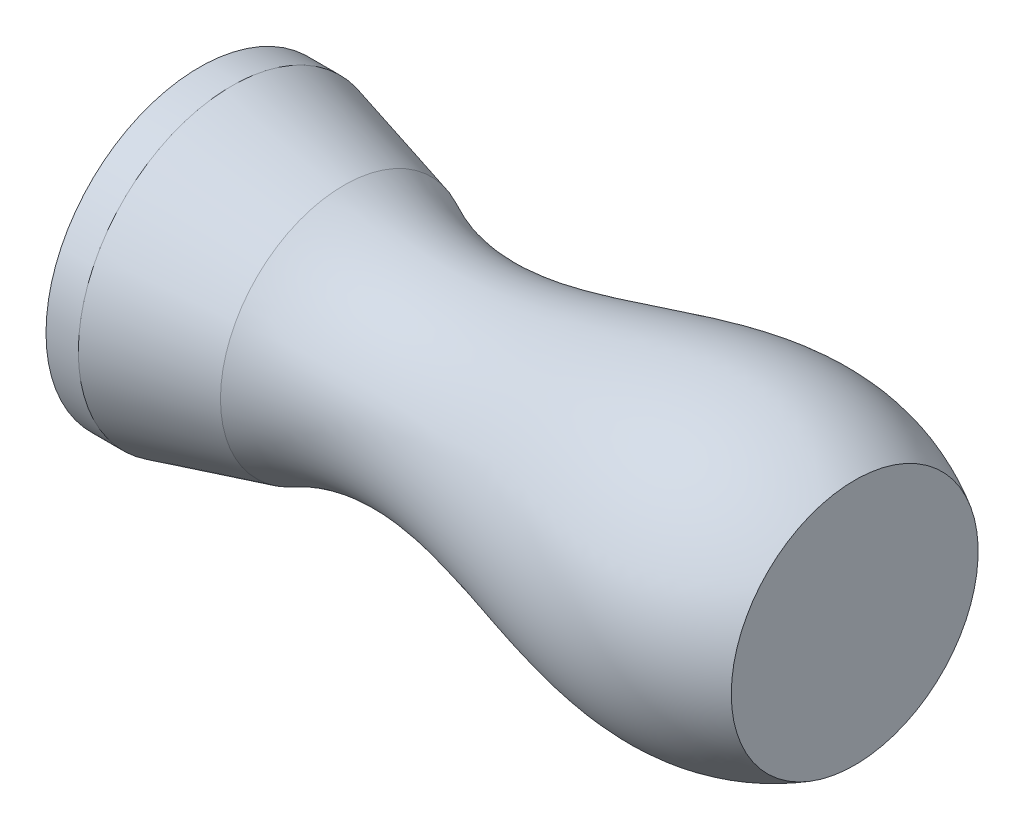
ISO-10303-21;
HEADER;
FILE_DESCRIPTION(('STEP AP214'),'2;1');
FILE_NAME('part.step','',(''),(''),'','','');
FILE_SCHEMA(('AUTOMOTIVE_DESIGN { 1 0 10303 214 1 1 1 1 }'));
ENDSEC;
DATA;
#1=APPLICATION_CONTEXT('core data for automotive mechanical design processes');
#2=APPLICATION_PROTOCOL_DEFINITION('international standard','automotive_design',2000,#1);
#3=PRODUCT_CONTEXT('',#1,'mechanical');
#4=PRODUCT('Part','Part','',(#3));
#5=PRODUCT_RELATED_PRODUCT_CATEGORY('part','',(#4));
#6=PRODUCT_DEFINITION_FORMATION('','',#4);
#7=PRODUCT_DEFINITION_CONTEXT('part definition',#1,'design');
#8=PRODUCT_DEFINITION('design','',#6,#7);
#9=PRODUCT_DEFINITION_SHAPE('','',#8);
#10=(LENGTH_UNIT() NAMED_UNIT(*) SI_UNIT(.MILLI.,.METRE.));
#11=(NAMED_UNIT(*) PLANE_ANGLE_UNIT() SI_UNIT($,.RADIAN.));
#12=(NAMED_UNIT(*) SI_UNIT($,.STERADIAN.) SOLID_ANGLE_UNIT());
#13=UNCERTAINTY_MEASURE_WITH_UNIT(LENGTH_MEASURE(1.E-05),#10,'distance_accuracy_value','');
#14=(GEOMETRIC_REPRESENTATION_CONTEXT(3) GLOBAL_UNCERTAINTY_ASSIGNED_CONTEXT((#13)) GLOBAL_UNIT_ASSIGNED_CONTEXT((#10,
#11,#12)) REPRESENTATION_CONTEXT('',''));
#15=CARTESIAN_POINT('',(0.,0.,0.));
#16=DIRECTION('',(0.,0.,1.));
#17=DIRECTION('',(1.,0.,0.));
#18=AXIS2_PLACEMENT_3D('',#15,#16,#17);
#19=CARTESIAN_POINT('',(0.,0.,0.));
#20=DIRECTION('',(1.,0.,0.));
#21=DIRECTION('',(0.,0.,-1.));
#22=AXIS2_PLACEMENT_3D('',#19,#20,#21);
#23=PLANE('',#22);
#24=CARTESIAN_POINT('',(0.,0.,0.));
#25=DIRECTION('',(-1.,0.,0.));
#26=DIRECTION('',(0.,0.,1.));
#27=AXIS2_PLACEMENT_3D('',#24,#25,#26);
#28=CIRCLE('',#27,145.873745228104);
#29=CARTESIAN_POINT('',(0.,0.,145.873745228104));
#30=VERTEX_POINT('',#29);
#31=EDGE_CURVE('E10',#30,#30,#28,.T.);
#32=ORIENTED_EDGE('',*,*,#31,.T.);
#33=EDGE_LOOP('',(#32));
#34=FACE_BOUND('',#33,.T.);
#35=ADVANCED_FACE('F31',(#34),#23,.F.);
#36=CARTESIAN_POINT('',(0.,0.,0.));
#37=DIRECTION('',(-1.,0.,0.));
#38=DIRECTION('',(0.,0.,1.));
#39=AXIS2_PLACEMENT_3D('',#36,#37,#38);
#40=CYLINDRICAL_SURFACE('',#39,145.873745228104);
#41=ORIENTED_EDGE('',*,*,#31,.F.);
#42=EDGE_LOOP('',(#41));
#43=FACE_BOUND('',#42,.T.);
#44=CARTESIAN_POINT('',(30.7453249064383,0.,0.));
#45=DIRECTION('',(-1.,0.,0.));
#46=DIRECTION('',(0.,0.,1.));
#47=AXIS2_PLACEMENT_3D('',#44,#45,#46);
#48=CIRCLE('',#47,145.873745228104);
#49=CARTESIAN_POINT('',(30.7453249064383,0.,145.873745228104));
#50=VERTEX_POINT('',#49);
#51=EDGE_CURVE('E37',#50,#50,#48,.T.);
#52=ORIENTED_EDGE('',*,*,#51,.T.);
#53=EDGE_LOOP('',(#52));
#54=FACE_BOUND('',#53,.T.);
#55=ADVANCED_FACE('F65',(#43,#54),#40,.T.);
#56=CARTESIAN_POINT('',(137.482211839673,0.,0.));
#57=DIRECTION('',(-1.,0.,0.));
#58=DIRECTION('',(0.,0.,1.));
#59=AXIS2_PLACEMENT_3D('',#56,#57,#58);
#60=CONICAL_SURFACE('',#59,117.410575379242,0.260602391747341);
#61=ORIENTED_EDGE('',*,*,#51,.F.);
#62=EDGE_LOOP('',(#61));
#63=FACE_BOUND('',#62,.T.);
#64=CARTESIAN_POINT('',(137.482211839673,0.,0.));
#65=DIRECTION('',(-1.,0.,0.));
#66=DIRECTION('',(0.,0.,1.));
#67=AXIS2_PLACEMENT_3D('',#64,#65,#66);
#68=CIRCLE('',#67,117.410575379242);
#69=CARTESIAN_POINT('',(137.482211839673,0.,117.410575379242));
#70=VERTEX_POINT('',#69);
#71=EDGE_CURVE('E41',#70,#70,#68,.T.);
#72=ORIENTED_EDGE('',*,*,#71,.T.);
#73=EDGE_LOOP('',(#72));
#74=FACE_BOUND('',#73,.T.);
#75=ADVANCED_FACE('F62',(#63,#74),#60,.T.);
#76=CARTESIAN_POINT('',(623.389181846792,117.410575690886,0.));
#77=CARTESIAN_POINT('',(457.050125006321,212.541472347293,0.));
#78=CARTESIAN_POINT('',(298.066617212216,35.9624079850313,0.));
#79=CARTESIAN_POINT('',(137.482211839673,117.410575379242,0.));
#80=B_SPLINE_CURVE_WITH_KNOTS('',3,(#76,#77,#78,#79),.UNSPECIFIED.,.F.,.F.,(4,4),(0.,1.),.UNSPECIFIED.);
#81=CARTESIAN_POINT('',(0.,0.,0.));
#82=DIRECTION('',(-1.,0.,0.));
#83=AXIS1_PLACEMENT('',#81,#82);
#84=SURFACE_OF_REVOLUTION('',#80,#83);
#85=ORIENTED_EDGE('',*,*,#71,.F.);
#86=EDGE_LOOP('',(#85));
#87=FACE_BOUND('',#86,.T.);
#88=CARTESIAN_POINT('',(623.389181846792,0.,0.));
#89=DIRECTION('',(-1.,0.,0.));
#90=DIRECTION('',(0.,0.,1.));
#91=AXIS2_PLACEMENT_3D('',#88,#89,#90);
#92=CIRCLE('',#91,117.410575690886);
#93=CARTESIAN_POINT('',(623.389181846792,0.,117.410575690886));
#94=VERTEX_POINT('',#93);
#95=EDGE_CURVE('E45',#94,#94,#92,.T.);
#96=ORIENTED_EDGE('',*,*,#95,.T.);
#97=EDGE_LOOP('',(#96));
#98=FACE_BOUND('',#97,.T.);
#99=ADVANCED_FACE('F57',(#87,#98),#84,.T.);
#100=CARTESIAN_POINT('',(623.389181846792,0.,0.));
#101=DIRECTION('',(-1.,0.,0.));
#102=DIRECTION('',(0.,0.,1.));
#103=AXIS2_PLACEMENT_3D('',#100,#101,#102);
#104=PLANE('',#103);
#105=ORIENTED_EDGE('',*,*,#95,.F.);
#106=EDGE_LOOP('',(#105));
#107=FACE_BOUND('',#106,.T.);
#108=ADVANCED_FACE('F61',(#107),#104,.F.);
#109=CLOSED_SHELL('',(#35,#55,#75,#99,#108));
#110=MANIFOLD_SOLID_BREP('B2',#109);
#111=ADVANCED_BREP_SHAPE_REPRESENTATION('',(#18,#110),#14);
#112=SHAPE_DEFINITION_REPRESENTATION(#9,#111);
ENDSEC;
END-ISO-10303-21;
